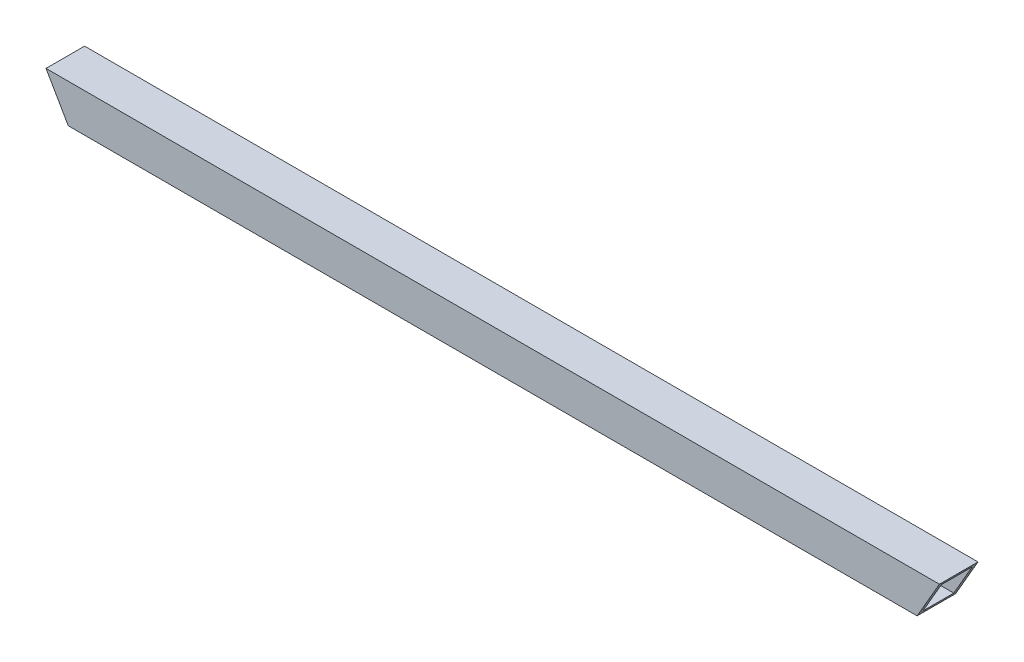
ISO-10303-21;
HEADER;
FILE_DESCRIPTION(('STEP AP214'),'2;1');
FILE_NAME('part.step','',(''),(''),'','','');
FILE_SCHEMA(('AUTOMOTIVE_DESIGN { 1 0 10303 214 1 1 1 1 }'));
ENDSEC;
DATA;
#1=APPLICATION_CONTEXT('core data for automotive mechanical design processes');
#2=APPLICATION_PROTOCOL_DEFINITION('international standard','automotive_design',2000,#1);
#3=PRODUCT_CONTEXT('',#1,'mechanical');
#4=PRODUCT('Part','Part','',(#3));
#5=PRODUCT_RELATED_PRODUCT_CATEGORY('part','',(#4));
#6=PRODUCT_DEFINITION_FORMATION('','',#4);
#7=PRODUCT_DEFINITION_CONTEXT('part definition',#1,'design');
#8=PRODUCT_DEFINITION('design','',#6,#7);
#9=PRODUCT_DEFINITION_SHAPE('','',#8);
#10=(LENGTH_UNIT() NAMED_UNIT(*) SI_UNIT(.MILLI.,.METRE.));
#11=(NAMED_UNIT(*) PLANE_ANGLE_UNIT() SI_UNIT($,.RADIAN.));
#12=(NAMED_UNIT(*) SI_UNIT($,.STERADIAN.) SOLID_ANGLE_UNIT());
#13=UNCERTAINTY_MEASURE_WITH_UNIT(LENGTH_MEASURE(1.E-05),#10,'distance_accuracy_value','');
#14=(GEOMETRIC_REPRESENTATION_CONTEXT(3) GLOBAL_UNCERTAINTY_ASSIGNED_CONTEXT((#13)) GLOBAL_UNIT_ASSIGNED_CONTEXT((#10,
#11,#12)) REPRESENTATION_CONTEXT('',''));
#15=CARTESIAN_POINT('',(0.,0.,0.));
#16=DIRECTION('',(0.,0.,1.));
#17=DIRECTION('',(1.,0.,0.));
#18=AXIS2_PLACEMENT_3D('',#15,#16,#17);
#19=CARTESIAN_POINT('',(-28.8675134594817,-50.0000000000001,50.));
#20=DIRECTION('',(-0.866025403784436,0.500000000000004,0.));
#21=DIRECTION('',(-0.500000000000004,-0.866025403784437,0.));
#22=AXIS2_PLACEMENT_3D('',#19,#20,#21);
#23=PLANE('',#22);
#24=DIRECTION('',(0.,0.,-1.));
#25=VECTOR('',#24,1.);
#26=CARTESIAN_POINT('',(-26.3675134594816,-45.669872981078,4.99999999999999));
#27=LINE('',#26,#25);
#28=CARTESIAN_POINT('',(-26.3675134594816,-45.669872981078,45.));
#29=VERTEX_POINT('',#28);
#30=CARTESIAN_POINT('',(-26.3675134594816,-45.669872981078,4.99999999999999));
#31=VERTEX_POINT('',#30);
#32=EDGE_CURVE('E114',#29,#31,#27,.T.);
#33=ORIENTED_EDGE('',*,*,#32,.F.);
#34=DIRECTION('',(-0.500000000000004,-0.866025403784436,0.));
#35=VECTOR('',#34,1.);
#36=CARTESIAN_POINT('',(-26.3675134594816,-45.669872981078,45.));
#37=LINE('',#36,#35);
#38=CARTESIAN_POINT('',(-2.50000000000002,-4.33012701892218,45.));
#39=VERTEX_POINT('',#38);
#40=EDGE_CURVE('E52',#39,#29,#37,.T.);
#41=ORIENTED_EDGE('',*,*,#40,.F.);
#42=DIRECTION('',(0.,0.,1.));
#43=VECTOR('',#42,1.);
#44=CARTESIAN_POINT('',(-2.50000000000002,-4.33012701892218,45.));
#45=LINE('',#44,#43);
#46=CARTESIAN_POINT('',(-2.50000000000002,-4.33012701892218,5.));
#47=VERTEX_POINT('',#46);
#48=EDGE_CURVE('E120',#47,#39,#45,.T.);
#49=ORIENTED_EDGE('',*,*,#48,.F.);
#50=DIRECTION('',(0.500000000000003,0.866025403784436,0.));
#51=VECTOR('',#50,1.);
#52=CARTESIAN_POINT('',(-2.50000000000002,-4.33012701892218,5.));
#53=LINE('',#52,#51);
#54=EDGE_CURVE('E105',#31,#47,#53,.T.);
#55=ORIENTED_EDGE('',*,*,#54,.F.);
#56=EDGE_LOOP('',(#33,#41,#49,#55));
#57=FACE_BOUND('',#56,.T.);
#58=DIRECTION('',(0.500000000000004,0.866025403784436,0.));
#59=VECTOR('',#58,1.);
#60=CARTESIAN_POINT('',(-28.8675134594817,-50.0000000000001,0.));
#61=LINE('',#60,#59);
#62=CARTESIAN_POINT('',(-28.8675134594817,-50.0000000000001,0.));
#63=VERTEX_POINT('',#62);
#64=CARTESIAN_POINT('',(0.,0.,0.));
#65=VERTEX_POINT('',#64);
#66=EDGE_CURVE('E127',#63,#65,#61,.T.);
#67=ORIENTED_EDGE('',*,*,#66,.T.);
#68=DIRECTION('',(0.,0.,-1.));
#69=VECTOR('',#68,1.);
#70=CARTESIAN_POINT('',(0.,0.,50.));
#71=LINE('',#70,#69);
#72=CARTESIAN_POINT('',(0.,0.,50.));
#73=VERTEX_POINT('',#72);
#74=EDGE_CURVE('E156',#73,#65,#71,.T.);
#75=ORIENTED_EDGE('',*,*,#74,.F.);
#76=DIRECTION('',(0.500000000000004,0.866025403784436,0.));
#77=VECTOR('',#76,1.);
#78=CARTESIAN_POINT('',(-28.8675134594817,-50.0000000000001,50.));
#79=LINE('',#78,#77);
#80=CARTESIAN_POINT('',(-28.8675134594817,-50.0000000000001,50.));
#81=VERTEX_POINT('',#80);
#82=EDGE_CURVE('E130',#81,#73,#79,.T.);
#83=ORIENTED_EDGE('',*,*,#82,.F.);
#84=DIRECTION('',(0.,0.,-1.));
#85=VECTOR('',#84,1.);
#86=CARTESIAN_POINT('',(-28.8675134594817,-50.0000000000001,50.));
#87=LINE('',#86,#85);
#88=EDGE_CURVE('E140',#81,#63,#87,.T.);
#89=ORIENTED_EDGE('',*,*,#88,.T.);
#90=EDGE_LOOP('',(#67,#75,#83,#89));
#91=FACE_BOUND('',#90,.T.);
#92=ADVANCED_FACE('F38',(#57,#91),#23,.F.);
#93=CARTESIAN_POINT('',(0.,0.,50.));
#94=DIRECTION('',(0.,-1.,0.));
#95=DIRECTION('',(1.,0.,0.));
#96=AXIS2_PLACEMENT_3D('',#93,#94,#95);
#97=PLANE('',#96);
#98=DIRECTION('',(-1.,0.,0.));
#99=VECTOR('',#98,1.);
#100=CARTESIAN_POINT('',(0.,0.,0.));
#101=LINE('',#100,#99);
#102=CARTESIAN_POINT('',(-1157.73502691896,-1.41781649497708E-13,0.));
#103=VERTEX_POINT('',#102);
#104=EDGE_CURVE('E143',#65,#103,#101,.T.);
#105=ORIENTED_EDGE('',*,*,#104,.T.);
#106=DIRECTION('',(0.,0.,-1.));
#107=VECTOR('',#106,1.);
#108=CARTESIAN_POINT('',(-1157.73502691896,-1.41781649497708E-13,50.));
#109=LINE('',#108,#107);
#110=CARTESIAN_POINT('',(-1157.73502691896,-1.41781649497708E-13,50.));
#111=VERTEX_POINT('',#110);
#112=EDGE_CURVE('E153',#111,#103,#109,.T.);
#113=ORIENTED_EDGE('',*,*,#112,.F.);
#114=DIRECTION('',(-1.,0.,0.));
#115=VECTOR('',#114,1.);
#116=CARTESIAN_POINT('',(0.,0.,50.));
#117=LINE('',#116,#115);
#118=EDGE_CURVE('E133',#73,#111,#117,.T.);
#119=ORIENTED_EDGE('',*,*,#118,.F.);
#120=ORIENTED_EDGE('',*,*,#74,.T.);
#121=EDGE_LOOP('',(#105,#113,#119,#120));
#122=FACE_BOUND('',#121,.T.);
#123=ADVANCED_FACE('F183',(#122),#97,.F.);
#124=CARTESIAN_POINT('',(-1157.73502691896,-1.41781649497708E-13,50.));
#125=DIRECTION('',(0.866025403784436,0.500000000000004,0.));
#126=DIRECTION('',(-0.500000000000004,0.866025403784437,0.));
#127=AXIS2_PLACEMENT_3D('',#124,#125,#126);
#128=PLANE('',#127);
#129=DIRECTION('',(0.,0.,1.));
#130=VECTOR('',#129,1.);
#131=CARTESIAN_POINT('',(-1155.23502691896,-4.33012701892232,50.));
#132=LINE('',#131,#130);
#133=CARTESIAN_POINT('',(-1155.23502691896,-4.33012701892231,5.));
#134=VERTEX_POINT('',#133);
#135=CARTESIAN_POINT('',(-1155.23502691896,-4.33012701892232,45.));
#136=VERTEX_POINT('',#135);
#137=EDGE_CURVE('E45',#134,#136,#132,.T.);
#138=ORIENTED_EDGE('',*,*,#137,.T.);
#139=DIRECTION('',(0.500000000000004,-0.866025403784437,0.));
#140=VECTOR('',#139,1.);
#141=CARTESIAN_POINT('',(-1157.73502691896,-1.42411088589169E-13,45.));
#142=LINE('',#141,#140);
#143=CARTESIAN_POINT('',(-1131.36751345948,-45.6698729810781,45.));
#144=VERTEX_POINT('',#143);
#145=EDGE_CURVE('E11',#136,#144,#142,.T.);
#146=ORIENTED_EDGE('',*,*,#145,.T.);
#147=DIRECTION('',(0.,0.,-1.));
#148=VECTOR('',#147,1.);
#149=CARTESIAN_POINT('',(-1131.36751345948,-45.6698729810781,50.));
#150=LINE('',#149,#148);
#151=CARTESIAN_POINT('',(-1131.36751345948,-45.6698729810781,4.99999999999999));
#152=VERTEX_POINT('',#151);
#153=EDGE_CURVE('E159',#144,#152,#150,.T.);
#154=ORIENTED_EDGE('',*,*,#153,.T.);
#155=DIRECTION('',(-0.500000000000004,0.866025403784437,0.));
#156=VECTOR('',#155,1.);
#157=CARTESIAN_POINT('',(-1157.73502691896,-1.29035507895621E-13,5.));
#158=LINE('',#157,#156);
#159=EDGE_CURVE('E108',#152,#134,#158,.T.);
#160=ORIENTED_EDGE('',*,*,#159,.T.);
#161=EDGE_LOOP('',(#138,#146,#154,#160));
#162=FACE_BOUND('',#161,.T.);
#163=DIRECTION('',(0.500000000000004,-0.866025403784436,0.));
#164=VECTOR('',#163,1.);
#165=CARTESIAN_POINT('',(-1157.73502691896,-1.41781649497708E-13,0.));
#166=LINE('',#165,#164);
#167=CARTESIAN_POINT('',(-1128.86751345948,-50.0000000000001,0.));
#168=VERTEX_POINT('',#167);
#169=EDGE_CURVE('E145',#103,#168,#166,.T.);
#170=ORIENTED_EDGE('',*,*,#169,.T.);
#171=DIRECTION('',(0.,0.,-1.));
#172=VECTOR('',#171,1.);
#173=CARTESIAN_POINT('',(-1128.86751345948,-50.0000000000001,50.));
#174=LINE('',#173,#172);
#175=CARTESIAN_POINT('',(-1128.86751345948,-50.0000000000001,50.));
#176=VERTEX_POINT('',#175);
#177=EDGE_CURVE('E150',#176,#168,#174,.T.);
#178=ORIENTED_EDGE('',*,*,#177,.F.);
#179=DIRECTION('',(0.500000000000004,-0.866025403784436,0.));
#180=VECTOR('',#179,1.);
#181=CARTESIAN_POINT('',(-1157.73502691896,-1.41781649497708E-13,50.));
#182=LINE('',#181,#180);
#183=EDGE_CURVE('E136',#111,#176,#182,.T.);
#184=ORIENTED_EDGE('',*,*,#183,.F.);
#185=ORIENTED_EDGE('',*,*,#112,.T.);
#186=EDGE_LOOP('',(#170,#178,#184,#185));
#187=FACE_BOUND('',#186,.T.);
#188=ADVANCED_FACE('F163',(#162,#187),#128,.F.);
#189=CARTESIAN_POINT('',(-1128.86751345948,-50.0000000000001,50.));
#190=DIRECTION('',(0.,1.,0.));
#191=DIRECTION('',(-1.,0.,0.));
#192=AXIS2_PLACEMENT_3D('',#189,#190,#191);
#193=PLANE('',#192);
#194=DIRECTION('',(1.,0.,0.));
#195=VECTOR('',#194,1.);
#196=CARTESIAN_POINT('',(-1128.86751345948,-50.0000000000001,0.));
#197=LINE('',#196,#195);
#198=EDGE_CURVE('E134',#168,#63,#197,.T.);
#199=ORIENTED_EDGE('',*,*,#198,.T.);
#200=ORIENTED_EDGE('',*,*,#88,.F.);
#201=DIRECTION('',(1.,0.,0.));
#202=VECTOR('',#201,1.);
#203=CARTESIAN_POINT('',(-1128.86751345948,-50.0000000000001,50.));
#204=LINE('',#203,#202);
#205=EDGE_CURVE('E138',#176,#81,#204,.T.);
#206=ORIENTED_EDGE('',*,*,#205,.F.);
#207=ORIENTED_EDGE('',*,*,#177,.T.);
#208=EDGE_LOOP('',(#199,#200,#206,#207));
#209=FACE_BOUND('',#208,.T.);
#210=ADVANCED_FACE('F191',(#209),#193,.F.);
#211=CARTESIAN_POINT('',(0.,0.,50.));
#212=DIRECTION('',(0.,0.,1.));
#213=DIRECTION('',(1.,0.,0.));
#214=AXIS2_PLACEMENT_3D('',#211,#212,#213);
#215=PLANE('',#214);
#216=ORIENTED_EDGE('',*,*,#82,.T.);
#217=ORIENTED_EDGE('',*,*,#118,.T.);
#218=ORIENTED_EDGE('',*,*,#183,.T.);
#219=ORIENTED_EDGE('',*,*,#205,.T.);
#220=EDGE_LOOP('',(#216,#217,#218,#219));
#221=FACE_BOUND('',#220,.T.);
#222=ADVANCED_FACE('F177',(#221),#215,.T.);
#223=CARTESIAN_POINT('',(0.,0.,0.));
#224=DIRECTION('',(0.,0.,1.));
#225=DIRECTION('',(1.,0.,0.));
#226=AXIS2_PLACEMENT_3D('',#223,#224,#225);
#227=PLANE('',#226);
#228=ORIENTED_EDGE('',*,*,#66,.F.);
#229=ORIENTED_EDGE('',*,*,#198,.F.);
#230=ORIENTED_EDGE('',*,*,#169,.F.);
#231=ORIENTED_EDGE('',*,*,#104,.F.);
#232=EDGE_LOOP('',(#228,#229,#230,#231));
#233=FACE_BOUND('',#232,.T.);
#234=ADVANCED_FACE('F170',(#233),#227,.F.);
#235=CARTESIAN_POINT('',(-1181.60254037844,-45.6698729810781,45.));
#236=DIRECTION('',(0.,0.,1.));
#237=DIRECTION('',(0.,-1.,0.));
#238=AXIS2_PLACEMENT_3D('',#235,#236,#237);
#239=PLANE('',#238);
#240=DIRECTION('',(1.,0.,0.));
#241=VECTOR('',#240,1.);
#242=CARTESIAN_POINT('',(-1157.73502691896,-4.33012701892232,45.));
#243=LINE('',#242,#241);
#244=EDGE_CURVE('E125',#136,#39,#243,.T.);
#245=ORIENTED_EDGE('',*,*,#244,.T.);
#246=ORIENTED_EDGE('',*,*,#40,.T.);
#247=DIRECTION('',(1.,0.,0.));
#248=VECTOR('',#247,1.);
#249=CARTESIAN_POINT('',(-1181.60254037844,-45.6698729810781,45.));
#250=LINE('',#249,#248);
#251=EDGE_CURVE('E111',#144,#29,#250,.T.);
#252=ORIENTED_EDGE('',*,*,#251,.F.);
#253=ORIENTED_EDGE('',*,*,#145,.F.);
#254=EDGE_LOOP('',(#245,#246,#252,#253));
#255=FACE_BOUND('',#254,.T.);
#256=ADVANCED_FACE('F168',(#255),#239,.F.);
#257=CARTESIAN_POINT('',(-1157.73502691896,-4.33012701892232,45.));
#258=DIRECTION('',(0.,1.,0.));
#259=DIRECTION('',(-1.,0.,0.));
#260=AXIS2_PLACEMENT_3D('',#257,#258,#259);
#261=PLANE('',#260);
#262=DIRECTION('',(1.,0.,0.));
#263=VECTOR('',#262,1.);
#264=CARTESIAN_POINT('',(-1157.73502691896,-4.33012701892232,5.));
#265=LINE('',#264,#263);
#266=EDGE_CURVE('E110',#134,#47,#265,.T.);
#267=ORIENTED_EDGE('',*,*,#266,.T.);
#268=ORIENTED_EDGE('',*,*,#48,.T.);
#269=ORIENTED_EDGE('',*,*,#244,.F.);
#270=ORIENTED_EDGE('',*,*,#137,.F.);
#271=EDGE_LOOP('',(#267,#268,#269,#270));
#272=FACE_BOUND('',#271,.T.);
#273=ADVANCED_FACE('F167',(#272),#261,.F.);
#274=CARTESIAN_POINT('',(-1157.73502691896,-4.33012701892232,5.));
#275=DIRECTION('',(0.,0.,-1.));
#276=DIRECTION('',(0.,1.,0.));
#277=AXIS2_PLACEMENT_3D('',#274,#275,#276);
#278=PLANE('',#277);
#279=DIRECTION('',(1.,0.,0.));
#280=VECTOR('',#279,1.);
#281=CARTESIAN_POINT('',(-1181.60254037844,-45.6698729810781,4.99999999999999));
#282=LINE('',#281,#280);
#283=EDGE_CURVE('E60',#152,#31,#282,.T.);
#284=ORIENTED_EDGE('',*,*,#283,.T.);
#285=ORIENTED_EDGE('',*,*,#54,.T.);
#286=ORIENTED_EDGE('',*,*,#266,.F.);
#287=ORIENTED_EDGE('',*,*,#159,.F.);
#288=EDGE_LOOP('',(#284,#285,#286,#287));
#289=FACE_BOUND('',#288,.T.);
#290=ADVANCED_FACE('F102',(#289),#278,.F.);
#291=CARTESIAN_POINT('',(-1181.60254037844,-45.6698729810781,4.99999999999999));
#292=DIRECTION('',(0.,-1.,0.));
#293=DIRECTION('',(0.,0.,-1.));
#294=AXIS2_PLACEMENT_3D('',#291,#292,#293);
#295=PLANE('',#294);
#296=ORIENTED_EDGE('',*,*,#251,.T.);
#297=ORIENTED_EDGE('',*,*,#32,.T.);
#298=ORIENTED_EDGE('',*,*,#283,.F.);
#299=ORIENTED_EDGE('',*,*,#153,.F.);
#300=EDGE_LOOP('',(#296,#297,#298,#299));
#301=FACE_BOUND('',#300,.T.);
#302=ADVANCED_FACE('F115',(#301),#295,.F.);
#303=CLOSED_SHELL('',(#92,#123,#188,#210,#222,#234,#256,#273,#290,#302));
#304=MANIFOLD_SOLID_BREP('B2',#303);
#305=ADVANCED_BREP_SHAPE_REPRESENTATION('',(#18,#304),#14);
#306=SHAPE_DEFINITION_REPRESENTATION(#9,#305);
ENDSEC;
END-ISO-10303-21;
